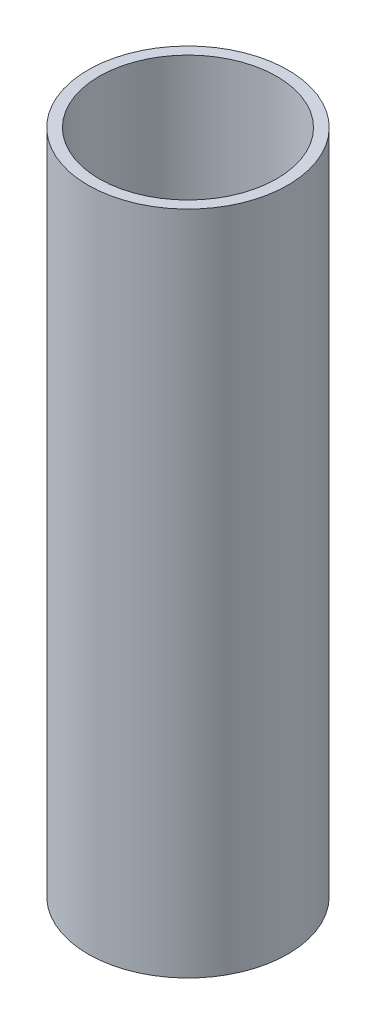
ISO-10303-21;
HEADER;
FILE_DESCRIPTION(('STEP AP214'),'2;1');
FILE_NAME('part.step','',(''),(''),'','','');
FILE_SCHEMA(('AUTOMOTIVE_DESIGN { 1 0 10303 214 1 1 1 1 }'));
ENDSEC;
DATA;
#1=APPLICATION_CONTEXT('core data for automotive mechanical design processes');
#2=APPLICATION_PROTOCOL_DEFINITION('international standard','automotive_design',2000,#1);
#3=PRODUCT_CONTEXT('',#1,'mechanical');
#4=PRODUCT('Part','Part','',(#3));
#5=PRODUCT_RELATED_PRODUCT_CATEGORY('part','',(#4));
#6=PRODUCT_DEFINITION_FORMATION('','',#4);
#7=PRODUCT_DEFINITION_CONTEXT('part definition',#1,'design');
#8=PRODUCT_DEFINITION('design','',#6,#7);
#9=PRODUCT_DEFINITION_SHAPE('','',#8);
#10=(LENGTH_UNIT() NAMED_UNIT(*) SI_UNIT(.MILLI.,.METRE.));
#11=(NAMED_UNIT(*) PLANE_ANGLE_UNIT() SI_UNIT($,.RADIAN.));
#12=(NAMED_UNIT(*) SI_UNIT($,.STERADIAN.) SOLID_ANGLE_UNIT());
#13=UNCERTAINTY_MEASURE_WITH_UNIT(LENGTH_MEASURE(1.E-05),#10,'distance_accuracy_value','');
#14=(GEOMETRIC_REPRESENTATION_CONTEXT(3) GLOBAL_UNCERTAINTY_ASSIGNED_CONTEXT((#13)) GLOBAL_UNIT_ASSIGNED_CONTEXT((#10,
#11,#12)) REPRESENTATION_CONTEXT('',''));
#15=CARTESIAN_POINT('',(0.,0.,0.));
#16=DIRECTION('',(0.,0.,1.));
#17=DIRECTION('',(1.,0.,0.));
#18=AXIS2_PLACEMENT_3D('',#15,#16,#17);
#19=CARTESIAN_POINT('',(0.,60.,0.));
#20=DIRECTION('',(0.,1.,0.));
#21=DIRECTION('',(0.,0.,1.));
#22=AXIS2_PLACEMENT_3D('',#19,#20,#21);
#23=PLANE('',#22);
#24=CARTESIAN_POINT('',(0.,60.,0.));
#25=DIRECTION('',(0.,1.,0.));
#26=DIRECTION('',(0.,0.,1.));
#27=AXIS2_PLACEMENT_3D('',#24,#25,#26);
#28=CIRCLE('',#27,9.);
#29=CARTESIAN_POINT('',(0.,60.,9.));
#30=VERTEX_POINT('',#29);
#31=EDGE_CURVE('E10',#30,#30,#28,.T.);
#32=ORIENTED_EDGE('',*,*,#31,.T.);
#33=EDGE_LOOP('',(#32));
#34=FACE_BOUND('',#33,.T.);
#35=CARTESIAN_POINT('',(0.,60.,0.));
#36=DIRECTION('',(0.,1.,0.));
#37=DIRECTION('',(0.,0.,1.));
#38=AXIS2_PLACEMENT_3D('',#35,#36,#37);
#39=CIRCLE('',#38,8.);
#40=CARTESIAN_POINT('',(0.,60.,8.));
#41=VERTEX_POINT('',#40);
#42=EDGE_CURVE('E44',#41,#41,#39,.T.);
#43=ORIENTED_EDGE('',*,*,#42,.F.);
#44=EDGE_LOOP('',(#43));
#45=FACE_BOUND('',#44,.T.);
#46=ADVANCED_FACE('F33',(#34,#45),#23,.T.);
#47=CARTESIAN_POINT('',(0.,0.,0.));
#48=DIRECTION('',(0.,1.,0.));
#49=DIRECTION('',(0.,0.,1.));
#50=AXIS2_PLACEMENT_3D('',#47,#48,#49);
#51=PLANE('',#50);
#52=CARTESIAN_POINT('',(0.,0.,0.));
#53=DIRECTION('',(0.,1.,0.));
#54=DIRECTION('',(0.,0.,1.));
#55=AXIS2_PLACEMENT_3D('',#52,#53,#54);
#56=CIRCLE('',#55,9.);
#57=CARTESIAN_POINT('',(0.,0.,9.));
#58=VERTEX_POINT('',#57);
#59=EDGE_CURVE('E37',#58,#58,#56,.T.);
#60=ORIENTED_EDGE('',*,*,#59,.F.);
#61=EDGE_LOOP('',(#60));
#62=FACE_BOUND('',#61,.T.);
#63=CARTESIAN_POINT('',(0.,0.,0.));
#64=DIRECTION('',(0.,1.,0.));
#65=DIRECTION('',(0.,0.,1.));
#66=AXIS2_PLACEMENT_3D('',#63,#64,#65);
#67=CIRCLE('',#66,8.);
#68=CARTESIAN_POINT('',(0.,0.,8.));
#69=VERTEX_POINT('',#68);
#70=EDGE_CURVE('E46',#69,#69,#67,.T.);
#71=ORIENTED_EDGE('',*,*,#70,.T.);
#72=EDGE_LOOP('',(#71));
#73=FACE_BOUND('',#72,.T.);
#74=ADVANCED_FACE('F56',(#62,#73),#51,.F.);
#75=CARTESIAN_POINT('',(0.,60.,0.));
#76=DIRECTION('',(0.,-1.,0.));
#77=DIRECTION('',(0.,0.,-1.));
#78=AXIS2_PLACEMENT_3D('',#75,#76,#77);
#79=CYLINDRICAL_SURFACE('',#78,9.);
#80=ORIENTED_EDGE('',*,*,#31,.F.);
#81=EDGE_LOOP('',(#80));
#82=FACE_BOUND('',#81,.T.);
#83=ORIENTED_EDGE('',*,*,#59,.T.);
#84=EDGE_LOOP('',(#83));
#85=FACE_BOUND('',#84,.T.);
#86=ADVANCED_FACE('F35',(#82,#85),#79,.T.);
#87=CARTESIAN_POINT('',(0.,60.,0.));
#88=DIRECTION('',(0.,-1.,0.));
#89=DIRECTION('',(0.,0.,-1.));
#90=AXIS2_PLACEMENT_3D('',#87,#88,#89);
#91=CYLINDRICAL_SURFACE('',#90,8.);
#92=ORIENTED_EDGE('',*,*,#42,.T.);
#93=EDGE_LOOP('',(#92));
#94=FACE_BOUND('',#93,.T.);
#95=ORIENTED_EDGE('',*,*,#70,.F.);
#96=EDGE_LOOP('',(#95));
#97=FACE_BOUND('',#96,.T.);
#98=ADVANCED_FACE('F52',(#94,#97),#91,.F.);
#99=CLOSED_SHELL('',(#46,#74,#86,#98));
#100=MANIFOLD_SOLID_BREP('B2',#99);
#101=ADVANCED_BREP_SHAPE_REPRESENTATION('',(#18,#100),#14);
#102=SHAPE_DEFINITION_REPRESENTATION(#9,#101);
ENDSEC;
END-ISO-10303-21;
